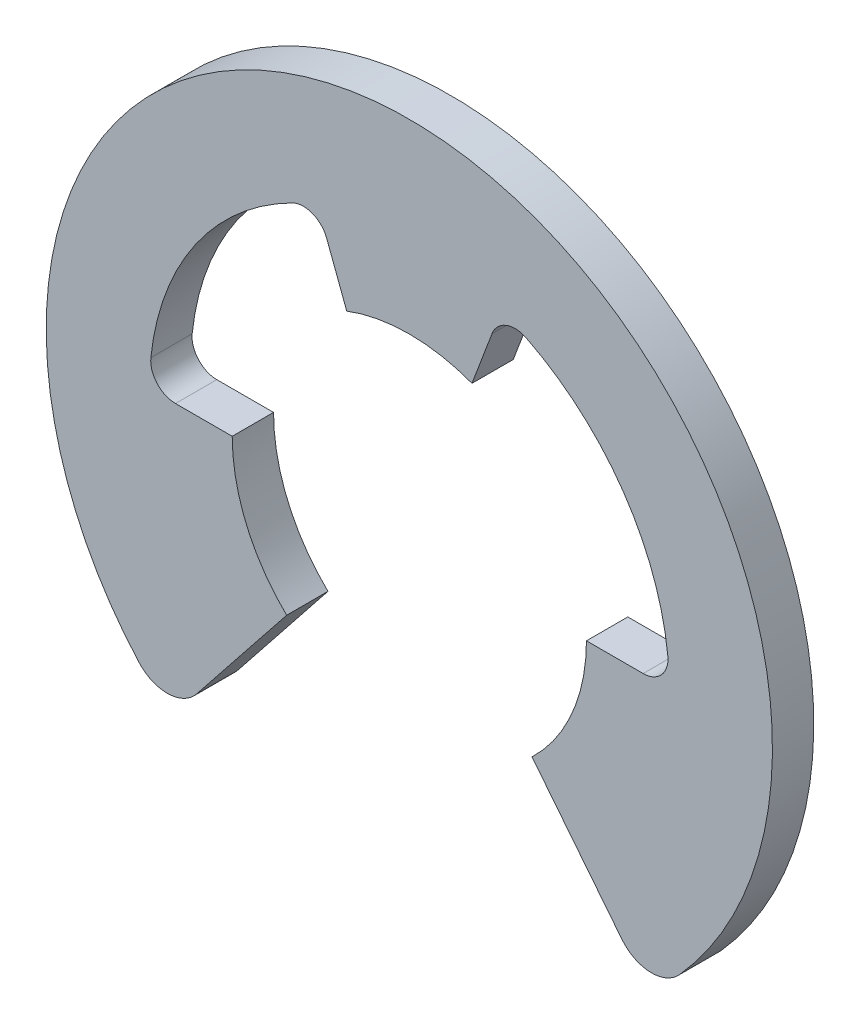
ISO-10303-21;
HEADER;
FILE_DESCRIPTION(('STEP AP214'),'2;1');
FILE_NAME('part.step','',(''),(''),'','','');
FILE_SCHEMA(('AUTOMOTIVE_DESIGN { 1 0 10303 214 1 1 1 1 }'));
ENDSEC;
DATA;
#1=APPLICATION_CONTEXT('core data for automotive mechanical design processes');
#2=APPLICATION_PROTOCOL_DEFINITION('international standard','automotive_design',2000,#1);
#3=PRODUCT_CONTEXT('',#1,'mechanical');
#4=PRODUCT('Part','Part','',(#3));
#5=PRODUCT_RELATED_PRODUCT_CATEGORY('part','',(#4));
#6=PRODUCT_DEFINITION_FORMATION('','',#4);
#7=PRODUCT_DEFINITION_CONTEXT('part definition',#1,'design');
#8=PRODUCT_DEFINITION('design','',#6,#7);
#9=PRODUCT_DEFINITION_SHAPE('','',#8);
#10=(LENGTH_UNIT() NAMED_UNIT(*) SI_UNIT(.MILLI.,.METRE.));
#11=(NAMED_UNIT(*) PLANE_ANGLE_UNIT() SI_UNIT($,.RADIAN.));
#12=(NAMED_UNIT(*) SI_UNIT($,.STERADIAN.) SOLID_ANGLE_UNIT());
#13=UNCERTAINTY_MEASURE_WITH_UNIT(LENGTH_MEASURE(1.E-05),#10,'distance_accuracy_value','');
#14=(GEOMETRIC_REPRESENTATION_CONTEXT(3) GLOBAL_UNCERTAINTY_ASSIGNED_CONTEXT((#13)) GLOBAL_UNIT_ASSIGNED_CONTEXT((#10,
#11,#12)) REPRESENTATION_CONTEXT('',''));
#15=CARTESIAN_POINT('',(0.,0.,0.));
#16=DIRECTION('',(0.,0.,1.));
#17=DIRECTION('',(1.,0.,0.));
#18=AXIS2_PLACEMENT_3D('',#15,#16,#17);
#19=CARTESIAN_POINT('',(-4.10124370368464,-3.6806830374352,16.5027366102466));
#20=DIRECTION('',(0.,0.,-1.));
#21=DIRECTION('',(0.,-1.,0.));
#22=AXIS2_PLACEMENT_3D('',#19,#20,#21);
#23=CYLINDRICAL_SURFACE('',#22,0.639316962564795);
#24=CARTESIAN_POINT('',(-4.10124370368464,-3.6806830374352,0.35));
#25=DIRECTION('',(0.,0.,1.));
#26=DIRECTION('',(0.,1.,0.));
#27=AXIS2_PLACEMENT_3D('',#24,#25,#26);
#28=CIRCLE('',#27,0.639316962564794);
#29=CARTESIAN_POINT('',(-4.10124370368464,-4.32,0.35));
#30=VERTEX_POINT('',#29);
#31=CARTESIAN_POINT('',(-3.60090903396732,-4.0786672040825,0.350000000000007));
#32=VERTEX_POINT('',#31);
#33=EDGE_CURVE('E347',#30,#32,#28,.T.);
#34=ORIENTED_EDGE('',*,*,#33,.F.);
#35=DIRECTION('',(0.,0.,-1.));
#36=VECTOR('',#35,1.);
#37=CARTESIAN_POINT('',(-4.10124370368464,-4.32,16.5027366102466));
#38=LINE('',#37,#36);
#39=CARTESIAN_POINT('',(-4.10124370368464,-4.32,-0.35));
#40=VERTEX_POINT('',#39);
#41=EDGE_CURVE('E455',#30,#40,#38,.T.);
#42=ORIENTED_EDGE('',*,*,#41,.T.);
#43=CARTESIAN_POINT('',(-4.10124370368464,-3.6806830374352,-0.35));
#44=DIRECTION('',(0.,0.,1.));
#45=DIRECTION('',(0.,-1.,0.));
#46=AXIS2_PLACEMENT_3D('',#43,#44,#45);
#47=CIRCLE('',#46,0.639316962564795);
#48=CARTESIAN_POINT('',(-3.60090903396732,-4.0786672040825,-0.35));
#49=VERTEX_POINT('',#48);
#50=EDGE_CURVE('E28',#40,#49,#47,.T.);
#51=ORIENTED_EDGE('',*,*,#50,.T.);
#52=DIRECTION('',(0.,0.,-1.));
#53=VECTOR('',#52,1.);
#54=CARTESIAN_POINT('',(-3.60090903396732,-4.0786672040825,0.350000000000007));
#55=LINE('',#54,#53);
#56=EDGE_CURVE('E400',#32,#49,#55,.T.);
#57=ORIENTED_EDGE('',*,*,#56,.F.);
#58=EDGE_LOOP('',(#34,#42,#51,#57));
#59=FACE_BOUND('',#58,.T.);
#60=ADVANCED_FACE('F17',(#59),#23,.T.);
#61=CARTESIAN_POINT('',(4.10124370368464,-3.6806830374352,16.5027366102466));
#62=DIRECTION('',(0.,0.,-1.));
#63=DIRECTION('',(0.,-1.,0.));
#64=AXIS2_PLACEMENT_3D('',#61,#62,#63);
#65=CYLINDRICAL_SURFACE('',#64,0.639316962564795);
#66=CARTESIAN_POINT('',(4.10124370368464,-3.6806830374352,0.35));
#67=DIRECTION('',(0.,0.,-1.));
#68=DIRECTION('',(0.,1.,0.));
#69=AXIS2_PLACEMENT_3D('',#66,#67,#68);
#70=CIRCLE('',#69,0.639316962564794);
#71=CARTESIAN_POINT('',(4.57704582287129,-4.1076941871732,0.350000000000007));
#72=VERTEX_POINT('',#71);
#73=CARTESIAN_POINT('',(4.10124370368464,-4.32,0.35));
#74=VERTEX_POINT('',#73);
#75=EDGE_CURVE('E88',#72,#74,#70,.T.);
#76=ORIENTED_EDGE('',*,*,#75,.T.);
#77=DIRECTION('',(0.,0.,-1.));
#78=VECTOR('',#77,1.);
#79=CARTESIAN_POINT('',(4.10124370368464,-4.32,16.5027366102466));
#80=LINE('',#79,#78);
#81=CARTESIAN_POINT('',(4.10124370368464,-4.32,-0.35));
#82=VERTEX_POINT('',#81);
#83=EDGE_CURVE('E344',#74,#82,#80,.T.);
#84=ORIENTED_EDGE('',*,*,#83,.T.);
#85=CARTESIAN_POINT('',(4.10124370368464,-3.6806830374352,-0.35));
#86=DIRECTION('',(0.,0.,-1.));
#87=DIRECTION('',(0.,-1.,0.));
#88=AXIS2_PLACEMENT_3D('',#85,#86,#87);
#89=CIRCLE('',#88,0.639316962564795);
#90=CARTESIAN_POINT('',(4.57704582287129,-4.1076941871732,-0.35));
#91=VERTEX_POINT('',#90);
#92=EDGE_CURVE('E11',#91,#82,#89,.T.);
#93=ORIENTED_EDGE('',*,*,#92,.F.);
#94=DIRECTION('',(0.,0.,-1.));
#95=VECTOR('',#94,1.);
#96=CARTESIAN_POINT('',(4.57704582287129,-4.1076941871732,16.5027366102466));
#97=LINE('',#96,#95);
#98=EDGE_CURVE('E357',#72,#91,#97,.T.);
#99=ORIENTED_EDGE('',*,*,#98,.F.);
#100=EDGE_LOOP('',(#76,#84,#93,#99));
#101=FACE_BOUND('',#100,.T.);
#102=ADVANCED_FACE('F474',(#101),#65,.T.);
#103=CARTESIAN_POINT('',(0.,0.,-0.35));
#104=DIRECTION('',(0.,0.,1.));
#105=DIRECTION('',(1.,0.,0.));
#106=AXIS2_PLACEMENT_3D('',#103,#104,#105);
#107=PLANE('',#106);
#108=DIRECTION('',(-0.62251463663762,-0.782608156852414,0.));
#109=VECTOR('',#108,1.);
#110=CARTESIAN_POINT('',(-0.218403044937664,0.173725626253037,-0.35));
#111=LINE('',#110,#109);
#112=CARTESIAN_POINT('',(-2.07784910821447,-2.16391845583246,-0.35));
#113=VERTEX_POINT('',#112);
#114=EDGE_CURVE('E353',#113,#49,#111,.T.);
#115=ORIENTED_EDGE('',*,*,#114,.T.);
#116=ORIENTED_EDGE('',*,*,#50,.F.);
#117=CARTESIAN_POINT('',(-4.10124370368464,-3.6806830374352,-0.35));
#118=DIRECTION('',(0.,0.,1.));
#119=DIRECTION('',(0.,-1.,0.));
#120=AXIS2_PLACEMENT_3D('',#117,#118,#119);
#121=CIRCLE('',#120,0.639316962564795);
#122=CARTESIAN_POINT('',(-4.57704582287129,-4.1076941871732,-0.35));
#123=VERTEX_POINT('',#122);
#124=EDGE_CURVE('E296',#123,#40,#121,.T.);
#125=ORIENTED_EDGE('',*,*,#124,.F.);
#126=CARTESIAN_POINT('',(0.,0.,-0.35));
#127=DIRECTION('',(0.,0.,-1.));
#128=DIRECTION('',(0.,-1.,0.));
#129=AXIS2_PLACEMENT_3D('',#126,#127,#128);
#130=CIRCLE('',#129,6.15);
#131=EDGE_CURVE('E354',#123,#91,#130,.T.);
#132=ORIENTED_EDGE('',*,*,#131,.T.);
#133=ORIENTED_EDGE('',*,*,#92,.T.);
#134=CARTESIAN_POINT('',(4.10124370368464,-3.6806830374352,-0.35));
#135=DIRECTION('',(0.,0.,-1.));
#136=DIRECTION('',(0.,-1.,0.));
#137=AXIS2_PLACEMENT_3D('',#134,#135,#136);
#138=CIRCLE('',#137,0.639316962564795);
#139=CARTESIAN_POINT('',(3.60090903396732,-4.0786672040825,-0.35));
#140=VERTEX_POINT('',#139);
#141=EDGE_CURVE('E186',#82,#140,#138,.T.);
#142=ORIENTED_EDGE('',*,*,#141,.T.);
#143=DIRECTION('',(0.62251463663762,-0.782608156852414,0.));
#144=VECTOR('',#143,1.);
#145=CARTESIAN_POINT('',(0.218403044937664,0.173725626253037,-0.35));
#146=LINE('',#145,#144);
#147=CARTESIAN_POINT('',(2.07784910821447,-2.16391845583246,-0.35));
#148=VERTEX_POINT('',#147);
#149=EDGE_CURVE('E423',#148,#140,#146,.T.);
#150=ORIENTED_EDGE('',*,*,#149,.F.);
#151=CARTESIAN_POINT('',(0.,0.,-0.35));
#152=DIRECTION('',(0.,0.,-1.));
#153=DIRECTION('',(0.,-1.,0.));
#154=AXIS2_PLACEMENT_3D('',#151,#152,#153);
#155=CIRCLE('',#154,3.);
#156=CARTESIAN_POINT('',(3.,0.,-0.35));
#157=VERTEX_POINT('',#156);
#158=EDGE_CURVE('E197',#157,#148,#155,.T.);
#159=ORIENTED_EDGE('',*,*,#158,.F.);
#160=DIRECTION('',(1.,0.,0.));
#161=VECTOR('',#160,1.);
#162=CARTESIAN_POINT('',(2.63,0.,-0.35));
#163=LINE('',#162,#161);
#164=CARTESIAN_POINT('',(3.96037227987639,0.,-0.35));
#165=VERTEX_POINT('',#164);
#166=EDGE_CURVE('E361',#157,#165,#163,.T.);
#167=ORIENTED_EDGE('',*,*,#166,.T.);
#168=CARTESIAN_POINT('',(3.96037227987639,0.42,-0.35));
#169=DIRECTION('',(0.,0.,1.));
#170=DIRECTION('',(0.,-1.,0.));
#171=AXIS2_PLACEMENT_3D('',#168,#169,#170);
#172=CIRCLE('',#171,0.42);
#173=CARTESIAN_POINT('',(4.37803020215074,0.464292888384901,-0.35));
#174=VERTEX_POINT('',#173);
#175=EDGE_CURVE('E152',#165,#174,#172,.T.);
#176=ORIENTED_EDGE('',*,*,#175,.T.);
#177=CARTESIAN_POINT('',(0.,0.,-0.35));
#178=DIRECTION('',(0.,0.,1.));
#179=DIRECTION('',(0.,-1.,0.));
#180=AXIS2_PLACEMENT_3D('',#177,#178,#179);
#181=CIRCLE('',#180,4.40258064516129);
#182=CARTESIAN_POINT('',(1.98217365095314,3.93111993643235,-0.35));
#183=VERTEX_POINT('',#182);
#184=EDGE_CURVE('E451',#174,#183,#181,.T.);
#185=ORIENTED_EDGE('',*,*,#184,.T.);
#186=CARTESIAN_POINT('',(1.79307707317318,3.55609662479439,-0.35));
#187=DIRECTION('',(0.,0.,1.));
#188=DIRECTION('',(0.,-1.,0.));
#189=AXIS2_PLACEMENT_3D('',#186,#187,#188);
#190=CIRCLE('',#189,0.42);
#191=CARTESIAN_POINT('',(1.40020304756192,3.70458904884357,-0.35));
#192=VERTEX_POINT('',#191);
#193=EDGE_CURVE('E251',#183,#192,#190,.T.);
#194=ORIENTED_EDGE('',*,*,#193,.T.);
#195=DIRECTION('',(-0.353553390593276,-0.935414346693485,0.));
#196=VECTOR('',#195,1.);
#197=CARTESIAN_POINT('',(0.92984541726031,2.46013973180386,-0.35));
#198=LINE('',#197,#196);
#199=CARTESIAN_POINT('',(1.06066017177982,2.80624304008046,-0.35));
#200=VERTEX_POINT('',#199);
#201=EDGE_CURVE('E244',#192,#200,#198,.T.);
#202=ORIENTED_EDGE('',*,*,#201,.T.);
#203=CARTESIAN_POINT('',(0.,0.,-0.35));
#204=DIRECTION('',(0.,0.,-1.));
#205=DIRECTION('',(0.,-1.,0.));
#206=AXIS2_PLACEMENT_3D('',#203,#204,#205);
#207=CIRCLE('',#206,3.);
#208=CARTESIAN_POINT('',(-1.06066017177982,2.80624304008046,-0.35));
#209=VERTEX_POINT('',#208);
#210=EDGE_CURVE('E249',#209,#200,#207,.T.);
#211=ORIENTED_EDGE('',*,*,#210,.F.);
#212=DIRECTION('',(-0.353553390593276,0.935414346693485,0.));
#213=VECTOR('',#212,1.);
#214=CARTESIAN_POINT('',(-0.92984541726031,2.46013973180386,-0.35));
#215=LINE('',#214,#213);
#216=CARTESIAN_POINT('',(-1.40020304756192,3.70458904884357,-0.35));
#217=VERTEX_POINT('',#216);
#218=EDGE_CURVE('E284',#209,#217,#215,.T.);
#219=ORIENTED_EDGE('',*,*,#218,.T.);
#220=CARTESIAN_POINT('',(-1.79307707317318,3.55609662479439,-0.35));
#221=DIRECTION('',(0.,0.,1.));
#222=DIRECTION('',(0.,-1.,0.));
#223=AXIS2_PLACEMENT_3D('',#220,#221,#222);
#224=CIRCLE('',#223,0.42);
#225=CARTESIAN_POINT('',(-1.98217365095314,3.93111993643235,-0.35));
#226=VERTEX_POINT('',#225);
#227=EDGE_CURVE('E21',#217,#226,#224,.T.);
#228=ORIENTED_EDGE('',*,*,#227,.T.);
#229=CARTESIAN_POINT('',(0.,0.,-0.35));
#230=DIRECTION('',(0.,0.,1.));
#231=DIRECTION('',(0.,-1.,0.));
#232=AXIS2_PLACEMENT_3D('',#229,#230,#231);
#233=CIRCLE('',#232,4.40258064516129);
#234=CARTESIAN_POINT('',(-4.37803020215074,0.4642928883849,-0.35));
#235=VERTEX_POINT('',#234);
#236=EDGE_CURVE('E305',#226,#235,#233,.T.);
#237=ORIENTED_EDGE('',*,*,#236,.T.);
#238=CARTESIAN_POINT('',(-3.96037227987639,0.42,-0.35));
#239=DIRECTION('',(0.,0.,1.));
#240=DIRECTION('',(0.,-1.,0.));
#241=AXIS2_PLACEMENT_3D('',#238,#239,#240);
#242=CIRCLE('',#241,0.42);
#243=CARTESIAN_POINT('',(-3.96037227987639,0.,-0.35));
#244=VERTEX_POINT('',#243);
#245=EDGE_CURVE('E392',#235,#244,#242,.T.);
#246=ORIENTED_EDGE('',*,*,#245,.T.);
#247=DIRECTION('',(1.,0.,0.));
#248=VECTOR('',#247,1.);
#249=CARTESIAN_POINT('',(-2.63,0.,-0.35));
#250=LINE('',#249,#248);
#251=CARTESIAN_POINT('',(-3.,0.,-0.35));
#252=VERTEX_POINT('',#251);
#253=EDGE_CURVE('E384',#244,#252,#250,.T.);
#254=ORIENTED_EDGE('',*,*,#253,.T.);
#255=CARTESIAN_POINT('',(0.,0.,-0.35));
#256=DIRECTION('',(0.,0.,-1.));
#257=DIRECTION('',(0.,-1.,0.));
#258=AXIS2_PLACEMENT_3D('',#255,#256,#257);
#259=CIRCLE('',#258,3.);
#260=EDGE_CURVE('E290',#113,#252,#259,.T.);
#261=ORIENTED_EDGE('',*,*,#260,.F.);
#262=EDGE_LOOP('',(#115,#116,#125,#132,#133,#142,#150,#159,#167,#176,#185,#194,#202,#211,#219,
#228,#237,#246,#254,#261));
#263=FACE_BOUND('',#262,.T.);
#264=ADVANCED_FACE('F247',(#263),#107,.F.);
#265=CARTESIAN_POINT('',(0.,0.,0.35));
#266=DIRECTION('',(0.,0.,1.));
#267=DIRECTION('',(1.,0.,0.));
#268=AXIS2_PLACEMENT_3D('',#265,#266,#267);
#269=PLANE('',#268);
#270=CARTESIAN_POINT('',(-4.10124370368464,-3.6806830374352,0.35));
#271=DIRECTION('',(0.,0.,1.));
#272=DIRECTION('',(0.,1.,0.));
#273=AXIS2_PLACEMENT_3D('',#270,#271,#272);
#274=CIRCLE('',#273,0.639316962564794);
#275=CARTESIAN_POINT('',(-4.57704582287129,-4.1076941871732,0.350000000000007));
#276=VERTEX_POINT('',#275);
#277=EDGE_CURVE('E375',#276,#30,#274,.T.);
#278=ORIENTED_EDGE('',*,*,#277,.T.);
#279=ORIENTED_EDGE('',*,*,#33,.T.);
#280=DIRECTION('',(-0.62251463663762,-0.782608156852414,0.));
#281=VECTOR('',#280,1.);
#282=CARTESIAN_POINT('',(-0.218403044937664,0.173725626253037,0.350000000000007));
#283=LINE('',#282,#281);
#284=CARTESIAN_POINT('',(-2.07784910821447,-2.16391845583246,0.350000000000007));
#285=VERTEX_POINT('',#284);
#286=EDGE_CURVE('E352',#285,#32,#283,.T.);
#287=ORIENTED_EDGE('',*,*,#286,.F.);
#288=CARTESIAN_POINT('',(0.,0.,0.35));
#289=DIRECTION('',(0.,0.,-1.));
#290=DIRECTION('',(0.,-1.,0.));
#291=AXIS2_PLACEMENT_3D('',#288,#289,#290);
#292=CIRCLE('',#291,3.);
#293=CARTESIAN_POINT('',(-3.,0.,0.35));
#294=VERTEX_POINT('',#293);
#295=EDGE_CURVE('E289',#285,#294,#292,.T.);
#296=ORIENTED_EDGE('',*,*,#295,.T.);
#297=DIRECTION('',(-1.,0.,0.));
#298=VECTOR('',#297,1.);
#299=CARTESIAN_POINT('',(0.,0.,0.35));
#300=LINE('',#299,#298);
#301=CARTESIAN_POINT('',(-3.96037227987639,0.,0.35));
#302=VERTEX_POINT('',#301);
#303=EDGE_CURVE('E388',#294,#302,#300,.T.);
#304=ORIENTED_EDGE('',*,*,#303,.T.);
#305=CARTESIAN_POINT('',(-3.96037227987639,0.42,0.35));
#306=DIRECTION('',(0.,0.,-1.));
#307=DIRECTION('',(0.,-1.,0.));
#308=AXIS2_PLACEMENT_3D('',#305,#306,#307);
#309=CIRCLE('',#308,0.42);
#310=CARTESIAN_POINT('',(-4.37803020215074,0.4642928883849,0.35));
#311=VERTEX_POINT('',#310);
#312=EDGE_CURVE('E316',#302,#311,#309,.T.);
#313=ORIENTED_EDGE('',*,*,#312,.T.);
#314=CARTESIAN_POINT('',(0.,0.,0.35));
#315=DIRECTION('',(0.,0.,-1.));
#316=DIRECTION('',(0.,-1.,0.));
#317=AXIS2_PLACEMENT_3D('',#314,#315,#316);
#318=CIRCLE('',#317,4.40258064516129);
#319=CARTESIAN_POINT('',(-1.98217365095314,3.93111993643235,0.35));
#320=VERTEX_POINT('',#319);
#321=EDGE_CURVE('E304',#311,#320,#318,.T.);
#322=ORIENTED_EDGE('',*,*,#321,.T.);
#323=CARTESIAN_POINT('',(-1.79307707317318,3.55609662479439,0.35));
#324=DIRECTION('',(0.,0.,-1.));
#325=DIRECTION('',(0.,-1.,0.));
#326=AXIS2_PLACEMENT_3D('',#323,#324,#325);
#327=CIRCLE('',#326,0.42);
#328=CARTESIAN_POINT('',(-1.40020304756192,3.70458904884357,0.35));
#329=VERTEX_POINT('',#328);
#330=EDGE_CURVE('E405',#320,#329,#327,.T.);
#331=ORIENTED_EDGE('',*,*,#330,.T.);
#332=DIRECTION('',(0.353553390593277,-0.935414346693484,0.));
#333=VECTOR('',#332,1.);
#334=CARTESIAN_POINT('',(-1.40020304756192,3.70458904884357,0.35));
#335=LINE('',#334,#333);
#336=CARTESIAN_POINT('',(-1.06066017177982,2.80624304008046,0.35));
#337=VERTEX_POINT('',#336);
#338=EDGE_CURVE('E459',#329,#337,#335,.T.);
#339=ORIENTED_EDGE('',*,*,#338,.T.);
#340=CARTESIAN_POINT('',(0.,0.,0.35));
#341=DIRECTION('',(0.,0.,1.));
#342=DIRECTION('',(0.,1.,0.));
#343=AXIS2_PLACEMENT_3D('',#340,#341,#342);
#344=CIRCLE('',#343,3.);
#345=CARTESIAN_POINT('',(1.06066017177982,2.80624304008046,0.35));
#346=VERTEX_POINT('',#345);
#347=EDGE_CURVE('E267',#346,#337,#344,.T.);
#348=ORIENTED_EDGE('',*,*,#347,.F.);
#349=DIRECTION('',(0.353553390593276,0.935414346693485,0.));
#350=VECTOR('',#349,1.);
#351=CARTESIAN_POINT('',(0.92984541726031,2.46013973180386,0.35));
#352=LINE('',#351,#350);
#353=CARTESIAN_POINT('',(1.40020304756192,3.70458904884357,0.35));
#354=VERTEX_POINT('',#353);
#355=EDGE_CURVE('E257',#346,#354,#352,.T.);
#356=ORIENTED_EDGE('',*,*,#355,.T.);
#357=CARTESIAN_POINT('',(1.79307707317318,3.55609662479439,0.35));
#358=DIRECTION('',(0.,0.,-1.));
#359=DIRECTION('',(0.,-1.,0.));
#360=AXIS2_PLACEMENT_3D('',#357,#358,#359);
#361=CIRCLE('',#360,0.42);
#362=CARTESIAN_POINT('',(1.98217365095314,3.93111993643235,0.35));
#363=VERTEX_POINT('',#362);
#364=EDGE_CURVE('E337',#354,#363,#361,.T.);
#365=ORIENTED_EDGE('',*,*,#364,.T.);
#366=CARTESIAN_POINT('',(0.,0.,0.35));
#367=DIRECTION('',(0.,0.,-1.));
#368=DIRECTION('',(0.,-1.,0.));
#369=AXIS2_PLACEMENT_3D('',#366,#367,#368);
#370=CIRCLE('',#369,4.40258064516129);
#371=CARTESIAN_POINT('',(4.37803020215074,0.464292888384901,0.35));
#372=VERTEX_POINT('',#371);
#373=EDGE_CURVE('E450',#363,#372,#370,.T.);
#374=ORIENTED_EDGE('',*,*,#373,.T.);
#375=CARTESIAN_POINT('',(3.96037227987639,0.42,0.35));
#376=DIRECTION('',(0.,0.,-1.));
#377=DIRECTION('',(0.,-1.,0.));
#378=AXIS2_PLACEMENT_3D('',#375,#376,#377);
#379=CIRCLE('',#378,0.42);
#380=CARTESIAN_POINT('',(3.96037227987639,0.,0.35));
#381=VERTEX_POINT('',#380);
#382=EDGE_CURVE('E141',#372,#381,#379,.T.);
#383=ORIENTED_EDGE('',*,*,#382,.T.);
#384=DIRECTION('',(-1.,0.,0.));
#385=VECTOR('',#384,1.);
#386=CARTESIAN_POINT('',(0.,0.,0.35));
#387=LINE('',#386,#385);
#388=CARTESIAN_POINT('',(3.,0.,0.35));
#389=VERTEX_POINT('',#388);
#390=EDGE_CURVE('E43',#381,#389,#387,.T.);
#391=ORIENTED_EDGE('',*,*,#390,.T.);
#392=CARTESIAN_POINT('',(0.,0.,0.35));
#393=DIRECTION('',(0.,0.,1.));
#394=DIRECTION('',(0.,1.,0.));
#395=AXIS2_PLACEMENT_3D('',#392,#393,#394);
#396=CIRCLE('',#395,3.);
#397=CARTESIAN_POINT('',(2.07784910821447,-2.16391845583246,0.350000000000007));
#398=VERTEX_POINT('',#397);
#399=EDGE_CURVE('E169',#398,#389,#396,.T.);
#400=ORIENTED_EDGE('',*,*,#399,.F.);
#401=DIRECTION('',(0.62251463663762,-0.782608156852414,0.));
#402=VECTOR('',#401,1.);
#403=CARTESIAN_POINT('',(0.218403044937664,0.173725626253037,0.350000000000007));
#404=LINE('',#403,#402);
#405=CARTESIAN_POINT('',(3.60090903396732,-4.0786672040825,0.350000000000007));
#406=VERTEX_POINT('',#405);
#407=EDGE_CURVE('E291',#398,#406,#404,.T.);
#408=ORIENTED_EDGE('',*,*,#407,.T.);
#409=CARTESIAN_POINT('',(4.10124370368464,-3.6806830374352,0.35));
#410=DIRECTION('',(0.,0.,-1.));
#411=DIRECTION('',(0.,1.,0.));
#412=AXIS2_PLACEMENT_3D('',#409,#410,#411);
#413=CIRCLE('',#412,0.639316962564794);
#414=EDGE_CURVE('E178',#74,#406,#413,.T.);
#415=ORIENTED_EDGE('',*,*,#414,.F.);
#416=ORIENTED_EDGE('',*,*,#75,.F.);
#417=CARTESIAN_POINT('',(0.,0.,0.35));
#418=DIRECTION('',(0.,0.,-1.));
#419=DIRECTION('',(0.,1.,0.));
#420=AXIS2_PLACEMENT_3D('',#417,#418,#419);
#421=CIRCLE('',#420,6.15);
#422=EDGE_CURVE('E299',#276,#72,#421,.T.);
#423=ORIENTED_EDGE('',*,*,#422,.F.);
#424=EDGE_LOOP('',(#278,#279,#287,#296,#304,#313,#322,#331,#339,#348,#356,#365,#374,#383,#391,
#400,#408,#415,#416,#423));
#425=FACE_BOUND('',#424,.T.);
#426=ADVANCED_FACE('F476',(#425),#269,.T.);
#427=CARTESIAN_POINT('',(2.63,0.,0.35));
#428=DIRECTION('',(0.,-1.,0.));
#429=DIRECTION('',(0.,0.,-1.));
#430=AXIS2_PLACEMENT_3D('',#427,#428,#429);
#431=PLANE('',#430);
#432=ORIENTED_EDGE('',*,*,#166,.F.);
#433=DIRECTION('',(0.,0.,1.));
#434=VECTOR('',#433,1.);
#435=CARTESIAN_POINT('',(3.,0.,0.35));
#436=LINE('',#435,#434);
#437=EDGE_CURVE('E280',#157,#389,#436,.T.);
#438=ORIENTED_EDGE('',*,*,#437,.T.);
#439=ORIENTED_EDGE('',*,*,#390,.F.);
#440=DIRECTION('',(0.,0.,1.));
#441=VECTOR('',#440,1.);
#442=CARTESIAN_POINT('',(3.96037227987639,0.,0.35));
#443=LINE('',#442,#441);
#444=EDGE_CURVE('E331',#165,#381,#443,.T.);
#445=ORIENTED_EDGE('',*,*,#444,.F.);
#446=EDGE_LOOP('',(#432,#438,#439,#445));
#447=FACE_BOUND('',#446,.T.);
#448=ADVANCED_FACE('F586',(#447),#431,.F.);
#449=CARTESIAN_POINT('',(3.96037227987639,0.42,0.35));
#450=DIRECTION('',(0.,0.,-1.));
#451=DIRECTION('',(0.,-1.,0.));
#452=AXIS2_PLACEMENT_3D('',#449,#450,#451);
#453=CYLINDRICAL_SURFACE('',#452,0.42);
#454=DIRECTION('',(0.,0.,1.));
#455=VECTOR('',#454,1.);
#456=CARTESIAN_POINT('',(4.37803020215074,0.464292888384901,0.35));
#457=LINE('',#456,#455);
#458=EDGE_CURVE('E396',#174,#372,#457,.T.);
#459=ORIENTED_EDGE('',*,*,#458,.F.);
#460=ORIENTED_EDGE('',*,*,#175,.F.);
#461=ORIENTED_EDGE('',*,*,#444,.T.);
#462=ORIENTED_EDGE('',*,*,#382,.F.);
#463=EDGE_LOOP('',(#459,#460,#461,#462));
#464=FACE_BOUND('',#463,.T.);
#465=ADVANCED_FACE('F582',(#464),#453,.F.);
#466=CARTESIAN_POINT('',(0.,0.,0.35));
#467=DIRECTION('',(0.,0.,-1.));
#468=DIRECTION('',(0.,-1.,0.));
#469=AXIS2_PLACEMENT_3D('',#466,#467,#468);
#470=CYLINDRICAL_SURFACE('',#469,4.40258064516129);
#471=ORIENTED_EDGE('',*,*,#458,.T.);
#472=ORIENTED_EDGE('',*,*,#373,.F.);
#473=DIRECTION('',(0.,0.,1.));
#474=VECTOR('',#473,1.);
#475=CARTESIAN_POINT('',(1.98217365095314,3.93111993643235,0.35));
#476=LINE('',#475,#474);
#477=EDGE_CURVE('E333',#183,#363,#476,.T.);
#478=ORIENTED_EDGE('',*,*,#477,.F.);
#479=ORIENTED_EDGE('',*,*,#184,.F.);
#480=EDGE_LOOP('',(#471,#472,#478,#479));
#481=FACE_BOUND('',#480,.T.);
#482=ADVANCED_FACE('F585',(#481),#470,.F.);
#483=CARTESIAN_POINT('',(1.79307707317318,3.55609662479439,0.35));
#484=DIRECTION('',(0.,0.,-1.));
#485=DIRECTION('',(0.,-1.,0.));
#486=AXIS2_PLACEMENT_3D('',#483,#484,#485);
#487=CYLINDRICAL_SURFACE('',#486,0.42);
#488=DIRECTION('',(0.,0.,1.));
#489=VECTOR('',#488,1.);
#490=CARTESIAN_POINT('',(1.40020304756192,3.70458904884357,0.35));
#491=LINE('',#490,#489);
#492=EDGE_CURVE('E256',#192,#354,#491,.T.);
#493=ORIENTED_EDGE('',*,*,#492,.F.);
#494=ORIENTED_EDGE('',*,*,#193,.F.);
#495=ORIENTED_EDGE('',*,*,#477,.T.);
#496=ORIENTED_EDGE('',*,*,#364,.F.);
#497=EDGE_LOOP('',(#493,#494,#495,#496));
#498=FACE_BOUND('',#497,.T.);
#499=ADVANCED_FACE('F590',(#498),#487,.F.);
#500=CARTESIAN_POINT('',(0.92984541726031,2.46013973180386,0.35));
#501=DIRECTION('',(-0.935414346693485,0.353553390593276,0.));
#502=DIRECTION('',(0.,0.,1.));
#503=AXIS2_PLACEMENT_3D('',#500,#501,#502);
#504=PLANE('',#503);
#505=ORIENTED_EDGE('',*,*,#355,.F.);
#506=DIRECTION('',(0.,0.,-1.));
#507=VECTOR('',#506,1.);
#508=CARTESIAN_POINT('',(1.06066017177982,2.80624304008046,0.35));
#509=LINE('',#508,#507);
#510=EDGE_CURVE('E260',#346,#200,#509,.T.);
#511=ORIENTED_EDGE('',*,*,#510,.T.);
#512=ORIENTED_EDGE('',*,*,#201,.F.);
#513=ORIENTED_EDGE('',*,*,#492,.T.);
#514=EDGE_LOOP('',(#505,#511,#512,#513));
#515=FACE_BOUND('',#514,.T.);
#516=ADVANCED_FACE('F261',(#515),#504,.F.);
#517=CARTESIAN_POINT('',(-0.92984541726031,2.46013973180386,0.35));
#518=DIRECTION('',(0.935414346693485,0.353553390593276,0.));
#519=DIRECTION('',(0.,0.,-1.));
#520=AXIS2_PLACEMENT_3D('',#517,#518,#519);
#521=PLANE('',#520);
#522=ORIENTED_EDGE('',*,*,#218,.F.);
#523=DIRECTION('',(0.,0.,1.));
#524=VECTOR('',#523,1.);
#525=CARTESIAN_POINT('',(-1.06066017177982,2.80624304008046,0.35));
#526=LINE('',#525,#524);
#527=EDGE_CURVE('E272',#209,#337,#526,.T.);
#528=ORIENTED_EDGE('',*,*,#527,.T.);
#529=ORIENTED_EDGE('',*,*,#338,.F.);
#530=DIRECTION('',(0.,0.,1.));
#531=VECTOR('',#530,1.);
#532=CARTESIAN_POINT('',(-1.40020304756192,3.70458904884357,0.35));
#533=LINE('',#532,#531);
#534=EDGE_CURVE('E409',#217,#329,#533,.T.);
#535=ORIENTED_EDGE('',*,*,#534,.F.);
#536=EDGE_LOOP('',(#522,#528,#529,#535));
#537=FACE_BOUND('',#536,.T.);
#538=ADVANCED_FACE('F567',(#537),#521,.F.);
#539=CARTESIAN_POINT('',(-1.79307707317318,3.55609662479439,0.35));
#540=DIRECTION('',(0.,0.,-1.));
#541=DIRECTION('',(0.,-1.,0.));
#542=AXIS2_PLACEMENT_3D('',#539,#540,#541);
#543=CYLINDRICAL_SURFACE('',#542,0.42);
#544=DIRECTION('',(0.,0.,1.));
#545=VECTOR('',#544,1.);
#546=CARTESIAN_POINT('',(-1.98217365095314,3.93111993643235,0.35));
#547=LINE('',#546,#545);
#548=EDGE_CURVE('E301',#226,#320,#547,.T.);
#549=ORIENTED_EDGE('',*,*,#548,.F.);
#550=ORIENTED_EDGE('',*,*,#227,.F.);
#551=ORIENTED_EDGE('',*,*,#534,.T.);
#552=ORIENTED_EDGE('',*,*,#330,.F.);
#553=EDGE_LOOP('',(#549,#550,#551,#552));
#554=FACE_BOUND('',#553,.T.);
#555=ADVANCED_FACE('F560',(#554),#543,.F.);
#556=CARTESIAN_POINT('',(0.,0.,0.35));
#557=DIRECTION('',(0.,0.,-1.));
#558=DIRECTION('',(0.,-1.,0.));
#559=AXIS2_PLACEMENT_3D('',#556,#557,#558);
#560=CYLINDRICAL_SURFACE('',#559,4.40258064516129);
#561=DIRECTION('',(0.,0.,1.));
#562=VECTOR('',#561,1.);
#563=CARTESIAN_POINT('',(-4.37803020215074,0.4642928883849,0.35));
#564=LINE('',#563,#562);
#565=EDGE_CURVE('E326',#235,#311,#564,.T.);
#566=ORIENTED_EDGE('',*,*,#565,.F.);
#567=ORIENTED_EDGE('',*,*,#236,.F.);
#568=ORIENTED_EDGE('',*,*,#548,.T.);
#569=ORIENTED_EDGE('',*,*,#321,.F.);
#570=EDGE_LOOP('',(#566,#567,#568,#569));
#571=FACE_BOUND('',#570,.T.);
#572=ADVANCED_FACE('F558',(#571),#560,.F.);
#573=CARTESIAN_POINT('',(-3.96037227987639,0.42,0.35));
#574=DIRECTION('',(0.,0.,-1.));
#575=DIRECTION('',(0.,-1.,0.));
#576=AXIS2_PLACEMENT_3D('',#573,#574,#575);
#577=CYLINDRICAL_SURFACE('',#576,0.42);
#578=DIRECTION('',(0.,0.,1.));
#579=VECTOR('',#578,1.);
#580=CARTESIAN_POINT('',(-3.96037227987639,0.,0.35));
#581=LINE('',#580,#579);
#582=EDGE_CURVE('E387',#244,#302,#581,.T.);
#583=ORIENTED_EDGE('',*,*,#582,.F.);
#584=ORIENTED_EDGE('',*,*,#245,.F.);
#585=ORIENTED_EDGE('',*,*,#565,.T.);
#586=ORIENTED_EDGE('',*,*,#312,.F.);
#587=EDGE_LOOP('',(#583,#584,#585,#586));
#588=FACE_BOUND('',#587,.T.);
#589=ADVANCED_FACE('F19',(#588),#577,.F.);
#590=CARTESIAN_POINT('',(-2.63,0.,0.35));
#591=DIRECTION('',(0.,-1.,0.));
#592=DIRECTION('',(0.,0.,-1.));
#593=AXIS2_PLACEMENT_3D('',#590,#591,#592);
#594=PLANE('',#593);
#595=ORIENTED_EDGE('',*,*,#303,.F.);
#596=DIRECTION('',(0.,0.,-1.));
#597=VECTOR('',#596,1.);
#598=CARTESIAN_POINT('',(-3.,0.,0.35));
#599=LINE('',#598,#597);
#600=EDGE_CURVE('E286',#294,#252,#599,.T.);
#601=ORIENTED_EDGE('',*,*,#600,.T.);
#602=ORIENTED_EDGE('',*,*,#253,.F.);
#603=ORIENTED_EDGE('',*,*,#582,.T.);
#604=EDGE_LOOP('',(#595,#601,#602,#603));
#605=FACE_BOUND('',#604,.T.);
#606=ADVANCED_FACE('F554',(#605),#594,.F.);
#607=CARTESIAN_POINT('',(0.,0.,0.35));
#608=DIRECTION('',(0.,0.,-1.));
#609=DIRECTION('',(0.,-1.,0.));
#610=AXIS2_PLACEMENT_3D('',#607,#608,#609);
#611=CYLINDRICAL_SURFACE('',#610,3.);
#612=ORIENTED_EDGE('',*,*,#210,.T.);
#613=ORIENTED_EDGE('',*,*,#510,.F.);
#614=ORIENTED_EDGE('',*,*,#347,.T.);
#615=ORIENTED_EDGE('',*,*,#527,.F.);
#616=EDGE_LOOP('',(#612,#613,#614,#615));
#617=FACE_BOUND('',#616,.T.);
#618=ADVANCED_FACE('F270',(#617),#611,.F.);
#619=CARTESIAN_POINT('',(0.,0.,0.35));
#620=DIRECTION('',(0.,0.,-1.));
#621=DIRECTION('',(0.,-1.,0.));
#622=AXIS2_PLACEMENT_3D('',#619,#620,#621);
#623=CYLINDRICAL_SURFACE('',#622,3.);
#624=ORIENTED_EDGE('',*,*,#399,.T.);
#625=ORIENTED_EDGE('',*,*,#437,.F.);
#626=ORIENTED_EDGE('',*,*,#158,.T.);
#627=DIRECTION('',(0.,0.,-1.));
#628=VECTOR('',#627,1.);
#629=CARTESIAN_POINT('',(2.07784910821447,-2.16391845583246,0.35));
#630=LINE('',#629,#628);
#631=EDGE_CURVE('E294',#398,#148,#630,.T.);
#632=ORIENTED_EDGE('',*,*,#631,.F.);
#633=EDGE_LOOP('',(#624,#625,#626,#632));
#634=FACE_BOUND('',#633,.T.);
#635=ADVANCED_FACE('F671',(#634),#623,.F.);
#636=CARTESIAN_POINT('',(0.,0.,0.35));
#637=DIRECTION('',(0.,0.,-1.));
#638=DIRECTION('',(0.,-1.,0.));
#639=AXIS2_PLACEMENT_3D('',#636,#637,#638);
#640=CYLINDRICAL_SURFACE('',#639,3.);
#641=ORIENTED_EDGE('',*,*,#260,.T.);
#642=ORIENTED_EDGE('',*,*,#600,.F.);
#643=ORIENTED_EDGE('',*,*,#295,.F.);
#644=DIRECTION('',(0.,0.,1.));
#645=VECTOR('',#644,1.);
#646=CARTESIAN_POINT('',(-2.07784910821447,-2.16391845583246,0.35));
#647=LINE('',#646,#645);
#648=EDGE_CURVE('E348',#113,#285,#647,.T.);
#649=ORIENTED_EDGE('',*,*,#648,.F.);
#650=EDGE_LOOP('',(#641,#642,#643,#649));
#651=FACE_BOUND('',#650,.T.);
#652=ADVANCED_FACE('F557',(#651),#640,.F.);
#653=CARTESIAN_POINT('',(4.10124370368464,-3.6806830374352,16.5027366102466));
#654=DIRECTION('',(0.,0.,-1.));
#655=DIRECTION('',(0.,-1.,0.));
#656=AXIS2_PLACEMENT_3D('',#653,#654,#655);
#657=CYLINDRICAL_SURFACE('',#656,0.639316962564795);
#658=ORIENTED_EDGE('',*,*,#83,.F.);
#659=ORIENTED_EDGE('',*,*,#414,.T.);
#660=DIRECTION('',(0.,0.,-1.));
#661=VECTOR('',#660,1.);
#662=CARTESIAN_POINT('',(3.60090903396732,-4.0786672040825,0.350000000000007));
#663=LINE('',#662,#661);
#664=EDGE_CURVE('E295',#406,#140,#663,.T.);
#665=ORIENTED_EDGE('',*,*,#664,.T.);
#666=ORIENTED_EDGE('',*,*,#141,.F.);
#667=EDGE_LOOP('',(#658,#659,#665,#666));
#668=FACE_BOUND('',#667,.T.);
#669=ADVANCED_FACE('F479',(#668),#657,.T.);
#670=CARTESIAN_POINT('',(0.,0.,16.5027366102466));
#671=DIRECTION('',(0.,0.,-1.));
#672=DIRECTION('',(0.,-1.,0.));
#673=AXIS2_PLACEMENT_3D('',#670,#671,#672);
#674=CYLINDRICAL_SURFACE('',#673,6.15);
#675=DIRECTION('',(0.,0.,-1.));
#676=VECTOR('',#675,1.);
#677=CARTESIAN_POINT('',(-4.57704582287129,-4.1076941871732,16.5027366102466));
#678=LINE('',#677,#676);
#679=EDGE_CURVE('E300',#276,#123,#678,.T.);
#680=ORIENTED_EDGE('',*,*,#679,.F.);
#681=ORIENTED_EDGE('',*,*,#422,.T.);
#682=ORIENTED_EDGE('',*,*,#98,.T.);
#683=ORIENTED_EDGE('',*,*,#131,.F.);
#684=EDGE_LOOP('',(#680,#681,#682,#683));
#685=FACE_BOUND('',#684,.T.);
#686=ADVANCED_FACE('F473',(#685),#674,.T.);
#687=CARTESIAN_POINT('',(-4.10124370368464,-3.6806830374352,16.5027366102466));
#688=DIRECTION('',(0.,0.,-1.));
#689=DIRECTION('',(0.,-1.,0.));
#690=AXIS2_PLACEMENT_3D('',#687,#688,#689);
#691=CYLINDRICAL_SURFACE('',#690,0.639316962564795);
#692=ORIENTED_EDGE('',*,*,#41,.F.);
#693=ORIENTED_EDGE('',*,*,#277,.F.);
#694=ORIENTED_EDGE('',*,*,#679,.T.);
#695=ORIENTED_EDGE('',*,*,#124,.T.);
#696=EDGE_LOOP('',(#692,#693,#694,#695));
#697=FACE_BOUND('',#696,.T.);
#698=ADVANCED_FACE('F494',(#697),#691,.T.);
#699=CARTESIAN_POINT('',(0.218403044937664,0.173725626253037,0.350000000000007));
#700=DIRECTION('',(0.782608156852414,0.62251463663762,0.));
#701=DIRECTION('',(0.,0.,-1.));
#702=AXIS2_PLACEMENT_3D('',#699,#700,#701);
#703=PLANE('',#702);
#704=ORIENTED_EDGE('',*,*,#149,.T.);
#705=ORIENTED_EDGE('',*,*,#664,.F.);
#706=ORIENTED_EDGE('',*,*,#407,.F.);
#707=ORIENTED_EDGE('',*,*,#631,.T.);
#708=EDGE_LOOP('',(#704,#705,#706,#707));
#709=FACE_BOUND('',#708,.T.);
#710=ADVANCED_FACE('F580',(#709),#703,.F.);
#711=CARTESIAN_POINT('',(-0.218403044937664,0.173725626253037,0.350000000000007));
#712=DIRECTION('',(0.782608156852414,-0.62251463663762,0.));
#713=DIRECTION('',(0.,0.,-1.));
#714=AXIS2_PLACEMENT_3D('',#711,#712,#713);
#715=PLANE('',#714);
#716=ORIENTED_EDGE('',*,*,#114,.F.);
#717=ORIENTED_EDGE('',*,*,#648,.T.);
#718=ORIENTED_EDGE('',*,*,#286,.T.);
#719=ORIENTED_EDGE('',*,*,#56,.T.);
#720=EDGE_LOOP('',(#716,#717,#718,#719));
#721=FACE_BOUND('',#720,.T.);
#722=ADVANCED_FACE('F437',(#721),#715,.T.);
#723=CLOSED_SHELL('',(#60,#102,#264,#426,#448,#465,#482,#499,#516,#538,#555,#572,#589,#606,#618,
#635,#652,#669,#686,#698,#710,#722));
#724=MANIFOLD_SOLID_BREP('B1',#723);
#725=ADVANCED_BREP_SHAPE_REPRESENTATION('',(#18,#724),#14);
#726=SHAPE_DEFINITION_REPRESENTATION(#9,#725);
ENDSEC;
END-ISO-10303-21;
